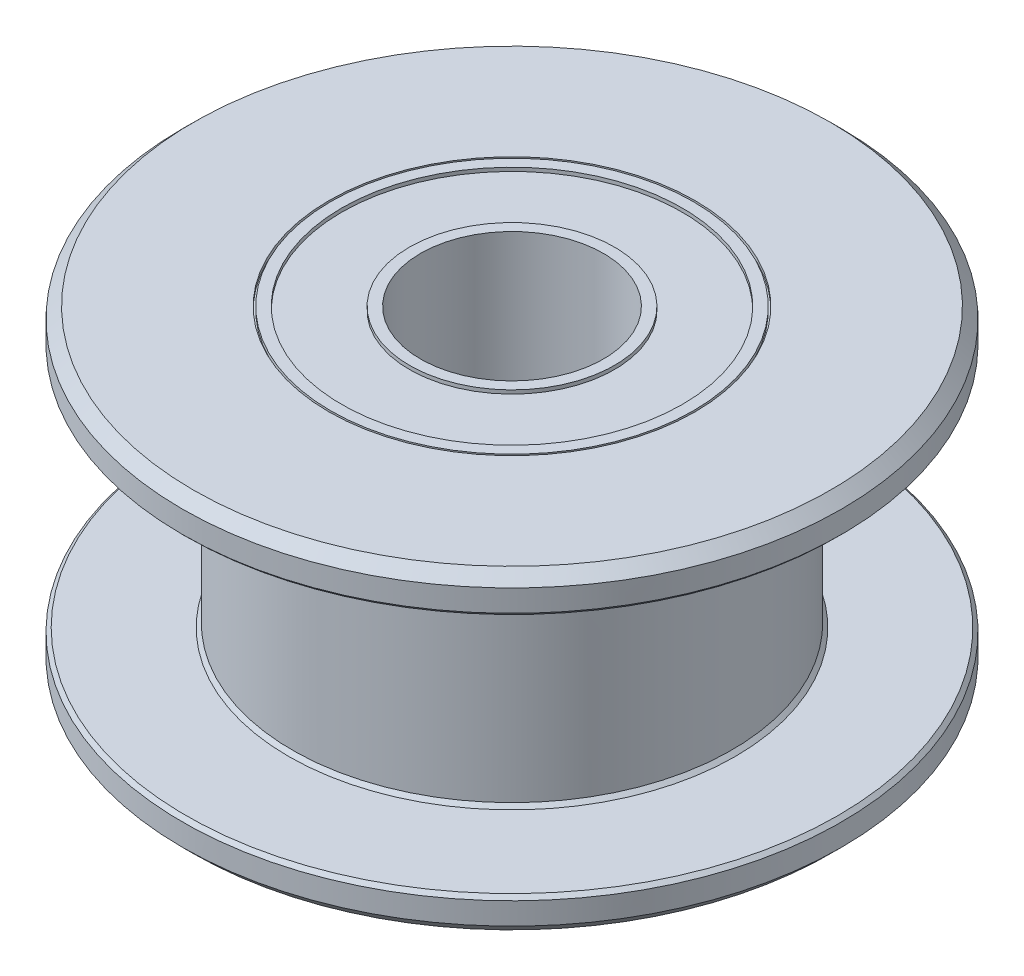
ISO-10303-21;
HEADER;
FILE_DESCRIPTION(('STEP AP214'),'2;1');
FILE_NAME('part.step','',(''),(''),'','','');
FILE_SCHEMA(('AUTOMOTIVE_DESIGN { 1 0 10303 214 1 1 1 1 }'));
ENDSEC;
DATA;
#1=APPLICATION_CONTEXT('core data for automotive mechanical design processes');
#2=APPLICATION_PROTOCOL_DEFINITION('international standard','automotive_design',2000,#1);
#3=PRODUCT_CONTEXT('',#1,'mechanical');
#4=PRODUCT('Part','Part','',(#3));
#5=PRODUCT_RELATED_PRODUCT_CATEGORY('part','',(#4));
#6=PRODUCT_DEFINITION_FORMATION('','',#4);
#7=PRODUCT_DEFINITION_CONTEXT('part definition',#1,'design');
#8=PRODUCT_DEFINITION('design','',#6,#7);
#9=PRODUCT_DEFINITION_SHAPE('','',#8);
#10=(LENGTH_UNIT() NAMED_UNIT(*) SI_UNIT(.MILLI.,.METRE.));
#11=(NAMED_UNIT(*) PLANE_ANGLE_UNIT() SI_UNIT($,.RADIAN.));
#12=(NAMED_UNIT(*) SI_UNIT($,.STERADIAN.) SOLID_ANGLE_UNIT());
#13=UNCERTAINTY_MEASURE_WITH_UNIT(LENGTH_MEASURE(1.E-05),#10,'distance_accuracy_value','');
#14=(GEOMETRIC_REPRESENTATION_CONTEXT(3) GLOBAL_UNCERTAINTY_ASSIGNED_CONTEXT((#13)) GLOBAL_UNIT_ASSIGNED_CONTEXT((#10,
#11,#12)) REPRESENTATION_CONTEXT('',''));
#15=CARTESIAN_POINT('',(0.,0.,0.));
#16=DIRECTION('',(0.,0.,1.));
#17=DIRECTION('',(1.,0.,0.));
#18=AXIS2_PLACEMENT_3D('',#15,#16,#17);
#19=CARTESIAN_POINT('',(-2.5,-20.7507456146053,0.));
#20=DIRECTION('',(0.,1.,0.));
#21=DIRECTION('',(-1.,0.,0.));
#22=AXIS2_PLACEMENT_3D('',#19,#20,#21);
#23=CYLINDRICAL_SURFACE('',#22,2.8);
#24=CARTESIAN_POINT('',(-2.5,-20.7507456146053,0.));
#25=DIRECTION('',(0.,1.,0.));
#26=DIRECTION('',(-1.,0.,0.));
#27=AXIS2_PLACEMENT_3D('',#24,#25,#26);
#28=CIRCLE('',#27,2.8);
#29=CARTESIAN_POINT('',(-5.3,-20.7507456146053,0.));
#30=VERTEX_POINT('',#29);
#31=EDGE_CURVE('E118',#30,#30,#28,.T.);
#32=ORIENTED_EDGE('',*,*,#31,.F.);
#33=EDGE_LOOP('',(#32));
#34=FACE_BOUND('',#33,.T.);
#35=CARTESIAN_POINT('',(-2.5,-20.8507456146053,0.));
#36=DIRECTION('',(0.,1.,0.));
#37=DIRECTION('',(-1.,0.,0.));
#38=AXIS2_PLACEMENT_3D('',#35,#36,#37);
#39=CIRCLE('',#38,2.8);
#40=CARTESIAN_POINT('',(-5.3,-20.8507456146053,0.));
#41=VERTEX_POINT('',#40);
#42=EDGE_CURVE('E85',#41,#41,#39,.T.);
#43=ORIENTED_EDGE('',*,*,#42,.T.);
#44=EDGE_LOOP('',(#43));
#45=FACE_BOUND('',#44,.T.);
#46=ADVANCED_FACE('F43',(#34,#45),#23,.T.);
#47=CARTESIAN_POINT('',(2.15,-20.8507456146053,0.));
#48=DIRECTION('',(0.,-1.,0.));
#49=DIRECTION('',(1.,0.,0.));
#50=AXIS2_PLACEMENT_3D('',#47,#48,#49);
#51=PLANE('',#50);
#52=ORIENTED_EDGE('',*,*,#42,.F.);
#53=EDGE_LOOP('',(#52));
#54=FACE_BOUND('',#53,.T.);
#55=CARTESIAN_POINT('',(-2.5,-20.8507456146053,0.));
#56=DIRECTION('',(0.,1.,0.));
#57=DIRECTION('',(-1.,0.,0.));
#58=AXIS2_PLACEMENT_3D('',#55,#56,#57);
#59=CIRCLE('',#58,4.65);
#60=CARTESIAN_POINT('',(-7.15,-20.8507456146053,0.));
#61=VERTEX_POINT('',#60);
#62=EDGE_CURVE('E84',#61,#61,#59,.T.);
#63=ORIENTED_EDGE('',*,*,#62,.T.);
#64=EDGE_LOOP('',(#63));
#65=FACE_BOUND('',#64,.T.);
#66=ADVANCED_FACE('F127',(#54,#65),#51,.F.);
#67=CARTESIAN_POINT('',(-2.5,-20.7507456146053,0.));
#68=DIRECTION('',(0.,1.,0.));
#69=DIRECTION('',(-1.,0.,0.));
#70=AXIS2_PLACEMENT_3D('',#67,#68,#69);
#71=CYLINDRICAL_SURFACE('',#70,4.65);
#72=ORIENTED_EDGE('',*,*,#62,.F.);
#73=EDGE_LOOP('',(#72));
#74=FACE_BOUND('',#73,.T.);
#75=CARTESIAN_POINT('',(-2.5,-20.7507456146053,0.));
#76=DIRECTION('',(0.,1.,0.));
#77=DIRECTION('',(-1.,0.,0.));
#78=AXIS2_PLACEMENT_3D('',#75,#76,#77);
#79=CIRCLE('',#78,4.65);
#80=CARTESIAN_POINT('',(-7.15,-20.7507456146053,0.));
#81=VERTEX_POINT('',#80);
#82=EDGE_CURVE('E86',#81,#81,#79,.T.);
#83=ORIENTED_EDGE('',*,*,#82,.T.);
#84=EDGE_LOOP('',(#83));
#85=FACE_BOUND('',#84,.T.);
#86=ADVANCED_FACE('F135',(#74,#85),#71,.F.);
#87=CARTESIAN_POINT('',(2.45,-20.7507456146053,0.));
#88=DIRECTION('',(0.,-1.,0.));
#89=DIRECTION('',(1.,0.,0.));
#90=AXIS2_PLACEMENT_3D('',#87,#88,#89);
#91=PLANE('',#90);
#92=ORIENTED_EDGE('',*,*,#82,.F.);
#93=EDGE_LOOP('',(#92));
#94=FACE_BOUND('',#93,.T.);
#95=CARTESIAN_POINT('',(-2.5,-20.7507456146053,0.));
#96=DIRECTION('',(0.,1.,0.));
#97=DIRECTION('',(-1.,0.,0.));
#98=AXIS2_PLACEMENT_3D('',#95,#96,#97);
#99=CIRCLE('',#98,4.95);
#100=CARTESIAN_POINT('',(-7.45,-20.7507456146053,0.));
#101=VERTEX_POINT('',#100);
#102=EDGE_CURVE('E93',#101,#101,#99,.T.);
#103=ORIENTED_EDGE('',*,*,#102,.T.);
#104=EDGE_LOOP('',(#103));
#105=FACE_BOUND('',#104,.T.);
#106=ADVANCED_FACE('F136',(#94,#105),#91,.F.);
#107=CARTESIAN_POINT('',(-2.5,-20.7507456146053,0.));
#108=DIRECTION('',(0.,1.,0.));
#109=DIRECTION('',(-1.,0.,0.));
#110=AXIS2_PLACEMENT_3D('',#107,#108,#109);
#111=CYLINDRICAL_SURFACE('',#110,4.95);
#112=ORIENTED_EDGE('',*,*,#102,.F.);
#113=EDGE_LOOP('',(#112));
#114=FACE_BOUND('',#113,.T.);
#115=CARTESIAN_POINT('',(-2.5,-20.8507456146053,0.));
#116=DIRECTION('',(0.,1.,0.));
#117=DIRECTION('',(-1.,0.,0.));
#118=AXIS2_PLACEMENT_3D('',#115,#116,#117);
#119=CIRCLE('',#118,4.95);
#120=CARTESIAN_POINT('',(-7.45,-20.8507456146053,0.));
#121=VERTEX_POINT('',#120);
#122=EDGE_CURVE('E94',#121,#121,#119,.T.);
#123=ORIENTED_EDGE('',*,*,#122,.T.);
#124=EDGE_LOOP('',(#123));
#125=FACE_BOUND('',#124,.T.);
#126=ADVANCED_FACE('F145',(#114,#125),#111,.T.);
#127=CARTESIAN_POINT('',(2.5,-20.8507456146053,0.));
#128=DIRECTION('',(0.,-1.,0.));
#129=DIRECTION('',(1.,0.,0.));
#130=AXIS2_PLACEMENT_3D('',#127,#128,#129);
#131=PLANE('',#130);
#132=ORIENTED_EDGE('',*,*,#122,.F.);
#133=EDGE_LOOP('',(#132));
#134=FACE_BOUND('',#133,.T.);
#135=CARTESIAN_POINT('',(-2.5,-20.8507456146053,0.));
#136=DIRECTION('',(0.,1.,0.));
#137=DIRECTION('',(-1.,0.,0.));
#138=AXIS2_PLACEMENT_3D('',#135,#136,#137);
#139=CIRCLE('',#138,5.);
#140=CARTESIAN_POINT('',(-7.5,-20.8507456146053,0.));
#141=VERTEX_POINT('',#140);
#142=EDGE_CURVE('E100',#141,#141,#139,.T.);
#143=ORIENTED_EDGE('',*,*,#142,.T.);
#144=EDGE_LOOP('',(#143));
#145=FACE_BOUND('',#144,.T.);
#146=ADVANCED_FACE('F147',(#134,#145),#131,.F.);
#147=CARTESIAN_POINT('',(-2.5,-20.7507456146053,0.));
#148=DIRECTION('',(0.,1.,0.));
#149=DIRECTION('',(-1.,0.,0.));
#150=AXIS2_PLACEMENT_3D('',#147,#148,#149);
#151=CYLINDRICAL_SURFACE('',#150,5.);
#152=ORIENTED_EDGE('',*,*,#142,.F.);
#153=EDGE_LOOP('',(#152));
#154=FACE_BOUND('',#153,.T.);
#155=CARTESIAN_POINT('',(-2.5,-20.7507456146053,0.));
#156=DIRECTION('',(0.,1.,0.));
#157=DIRECTION('',(-1.,0.,0.));
#158=AXIS2_PLACEMENT_3D('',#155,#156,#157);
#159=CIRCLE('',#158,5.);
#160=CARTESIAN_POINT('',(-7.5,-20.7507456146053,0.));
#161=VERTEX_POINT('',#160);
#162=EDGE_CURVE('E99',#161,#161,#159,.T.);
#163=ORIENTED_EDGE('',*,*,#162,.T.);
#164=EDGE_LOOP('',(#163));
#165=FACE_BOUND('',#164,.T.);
#166=ADVANCED_FACE('F156',(#154,#165),#151,.F.);
#167=CARTESIAN_POINT('',(6.5,-20.7507456146053,0.));
#168=DIRECTION('',(0.,-1.,0.));
#169=DIRECTION('',(1.,0.,0.));
#170=AXIS2_PLACEMENT_3D('',#167,#168,#169);
#171=PLANE('',#170);
#172=CARTESIAN_POINT('',(-2.5,-20.7507456146053,0.));
#173=DIRECTION('',(0.,-1.,0.));
#174=DIRECTION('',(1.,0.,0.));
#175=AXIS2_PLACEMENT_3D('',#172,#173,#174);
#176=CIRCLE('',#175,8.69999999999999);
#177=CARTESIAN_POINT('',(-2.5,-20.7507456146053,-8.69999999999999));
#178=VERTEX_POINT('',#177);
#179=EDGE_CURVE('E71',#178,#178,#176,.F.);
#180=ORIENTED_EDGE('',*,*,#179,.T.);
#181=EDGE_LOOP('',(#180));
#182=FACE_BOUND('',#181,.T.);
#183=ORIENTED_EDGE('',*,*,#162,.F.);
#184=EDGE_LOOP('',(#183));
#185=FACE_BOUND('',#184,.T.);
#186=ADVANCED_FACE('F165',(#182,#185),#171,.F.);
#187=CARTESIAN_POINT('',(-2.5,-20.7507456146053,0.));
#188=DIRECTION('',(0.,1.,0.));
#189=DIRECTION('',(-1.,0.,0.));
#190=AXIS2_PLACEMENT_3D('',#187,#188,#189);
#191=CYLINDRICAL_SURFACE('',#190,9.);
#192=CARTESIAN_POINT('',(-2.5,-21.6507456146053,0.));
#193=DIRECTION('',(0.,1.,0.));
#194=DIRECTION('',(0.,0.,1.));
#195=AXIS2_PLACEMENT_3D('',#192,#193,#194);
#196=CIRCLE('',#195,9.);
#197=CARTESIAN_POINT('',(-2.5,-21.6507456146053,9.));
#198=VERTEX_POINT('',#197);
#199=EDGE_CURVE('E51',#198,#198,#196,.T.);
#200=ORIENTED_EDGE('',*,*,#199,.T.);
#201=EDGE_LOOP('',(#200));
#202=FACE_BOUND('',#201,.T.);
#203=CARTESIAN_POINT('',(-2.5,-21.0507456146053,0.));
#204=DIRECTION('',(0.,-1.,0.));
#205=DIRECTION('',(0.,0.,-1.));
#206=AXIS2_PLACEMENT_3D('',#203,#204,#205);
#207=CIRCLE('',#206,9.);
#208=CARTESIAN_POINT('',(-2.5,-21.0507456146053,-9.));
#209=VERTEX_POINT('',#208);
#210=EDGE_CURVE('E69',#209,#209,#207,.T.);
#211=ORIENTED_EDGE('',*,*,#210,.T.);
#212=EDGE_LOOP('',(#211));
#213=FACE_BOUND('',#212,.T.);
#214=ADVANCED_FACE('F170',(#202,#213),#191,.T.);
#215=CARTESIAN_POINT('',(6.5,-21.7507456146053,0.));
#216=DIRECTION('',(0.,1.,0.));
#217=DIRECTION('',(-1.,0.,0.));
#218=AXIS2_PLACEMENT_3D('',#215,#216,#217);
#219=PLANE('',#218);
#220=CARTESIAN_POINT('',(-2.5,-21.7507456146053,0.));
#221=DIRECTION('',(0.,1.,0.));
#222=DIRECTION('',(-1.,0.,0.));
#223=AXIS2_PLACEMENT_3D('',#220,#221,#222);
#224=CIRCLE('',#223,8.89999999999999);
#225=CARTESIAN_POINT('',(-11.4,-21.7507456146053,0.));
#226=VERTEX_POINT('',#225);
#227=EDGE_CURVE('E10',#226,#226,#224,.F.);
#228=ORIENTED_EDGE('',*,*,#227,.T.);
#229=EDGE_LOOP('',(#228));
#230=FACE_BOUND('',#229,.T.);
#231=CARTESIAN_POINT('',(-2.5,-21.7507456146053,0.));
#232=DIRECTION('',(0.,1.,0.));
#233=DIRECTION('',(-1.,0.,0.));
#234=AXIS2_PLACEMENT_3D('',#231,#232,#233);
#235=CIRCLE('',#234,6.);
#236=CARTESIAN_POINT('',(-8.5,-21.7507456146053,0.));
#237=VERTEX_POINT('',#236);
#238=EDGE_CURVE('E103',#237,#237,#235,.T.);
#239=ORIENTED_EDGE('',*,*,#238,.T.);
#240=EDGE_LOOP('',(#239));
#241=FACE_BOUND('',#240,.T.);
#242=ADVANCED_FACE('F171',(#230,#241),#219,.F.);
#243=CARTESIAN_POINT('',(-2.5,-20.7507456146053,0.));
#244=DIRECTION('',(0.,1.,0.));
#245=DIRECTION('',(-1.,0.,0.));
#246=AXIS2_PLACEMENT_3D('',#243,#244,#245);
#247=CYLINDRICAL_SURFACE('',#246,6.);
#248=CARTESIAN_POINT('',(-2.5,-28.2507456146053,0.));
#249=DIRECTION('',(0.,-1.,0.));
#250=DIRECTION('',(0.,0.,-1.));
#251=AXIS2_PLACEMENT_3D('',#248,#249,#250);
#252=CIRCLE('',#251,6.);
#253=CARTESIAN_POINT('',(-2.5,-28.2507456146053,-6.));
#254=VERTEX_POINT('',#253);
#255=EDGE_CURVE('E54',#254,#254,#252,.F.);
#256=ORIENTED_EDGE('',*,*,#255,.T.);
#257=EDGE_LOOP('',(#256));
#258=FACE_BOUND('',#257,.T.);
#259=ORIENTED_EDGE('',*,*,#238,.F.);
#260=EDGE_LOOP('',(#259));
#261=FACE_BOUND('',#260,.T.);
#262=ADVANCED_FACE('F213',(#258,#261),#247,.T.);
#263=CARTESIAN_POINT('',(3.5,-28.3507456146053,0.));
#264=DIRECTION('',(0.,-1.,0.));
#265=DIRECTION('',(1.,0.,0.));
#266=AXIS2_PLACEMENT_3D('',#263,#264,#265);
#267=PLANE('',#266);
#268=CARTESIAN_POINT('',(-2.5,-28.3507456146053,0.));
#269=DIRECTION('',(0.,-1.,0.));
#270=DIRECTION('',(1.,0.,0.));
#271=AXIS2_PLACEMENT_3D('',#268,#269,#270);
#272=CIRCLE('',#271,8.89999999999999);
#273=CARTESIAN_POINT('',(6.39999999999999,-28.3507456146053,0.));
#274=VERTEX_POINT('',#273);
#275=EDGE_CURVE('E64',#274,#274,#272,.F.);
#276=ORIENTED_EDGE('',*,*,#275,.T.);
#277=EDGE_LOOP('',(#276));
#278=FACE_BOUND('',#277,.T.);
#279=CARTESIAN_POINT('',(-2.5,-28.3507456146053,0.));
#280=DIRECTION('',(0.,-1.,0.));
#281=DIRECTION('',(1.,0.,0.));
#282=AXIS2_PLACEMENT_3D('',#279,#280,#281);
#283=CIRCLE('',#282,6.10000000000001);
#284=CARTESIAN_POINT('',(3.60000000000001,-28.3507456146053,0.));
#285=VERTEX_POINT('',#284);
#286=EDGE_CURVE('E70',#285,#285,#283,.T.);
#287=ORIENTED_EDGE('',*,*,#286,.T.);
#288=EDGE_LOOP('',(#287));
#289=FACE_BOUND('',#288,.T.);
#290=ADVANCED_FACE('F216',(#278,#289),#267,.F.);
#291=CARTESIAN_POINT('',(-2.5,-20.7507456146053,0.));
#292=DIRECTION('',(0.,1.,0.));
#293=DIRECTION('',(-1.,0.,0.));
#294=AXIS2_PLACEMENT_3D('',#291,#292,#293);
#295=CYLINDRICAL_SURFACE('',#294,9.);
#296=CARTESIAN_POINT('',(-2.5,-28.4507456146053,0.));
#297=DIRECTION('',(0.,-1.,0.));
#298=DIRECTION('',(0.,0.,-1.));
#299=AXIS2_PLACEMENT_3D('',#296,#297,#298);
#300=CIRCLE('',#299,9.);
#301=CARTESIAN_POINT('',(-2.5,-28.4507456146053,-9.));
#302=VERTEX_POINT('',#301);
#303=EDGE_CURVE('E56',#302,#302,#300,.T.);
#304=ORIENTED_EDGE('',*,*,#303,.T.);
#305=EDGE_LOOP('',(#304));
#306=FACE_BOUND('',#305,.T.);
#307=CARTESIAN_POINT('',(-2.5,-29.0507456146053,0.));
#308=DIRECTION('',(0.,1.,0.));
#309=DIRECTION('',(0.,0.,1.));
#310=AXIS2_PLACEMENT_3D('',#307,#308,#309);
#311=CIRCLE('',#310,9.);
#312=CARTESIAN_POINT('',(-2.5,-29.0507456146053,9.));
#313=VERTEX_POINT('',#312);
#314=EDGE_CURVE('E79',#313,#313,#311,.T.);
#315=ORIENTED_EDGE('',*,*,#314,.T.);
#316=EDGE_LOOP('',(#315));
#317=FACE_BOUND('',#316,.T.);
#318=ADVANCED_FACE('F227',(#306,#317),#295,.T.);
#319=CARTESIAN_POINT('',(6.5,-29.3507456146053,0.));
#320=DIRECTION('',(0.,1.,0.));
#321=DIRECTION('',(-1.,0.,0.));
#322=AXIS2_PLACEMENT_3D('',#319,#320,#321);
#323=PLANE('',#322);
#324=CARTESIAN_POINT('',(-2.5,-29.3507456146053,0.));
#325=DIRECTION('',(0.,1.,0.));
#326=DIRECTION('',(-1.,0.,0.));
#327=AXIS2_PLACEMENT_3D('',#324,#325,#326);
#328=CIRCLE('',#327,8.70000000000001);
#329=CARTESIAN_POINT('',(-11.2,-29.3507456146053,0.));
#330=VERTEX_POINT('',#329);
#331=EDGE_CURVE('E77',#330,#330,#328,.F.);
#332=ORIENTED_EDGE('',*,*,#331,.T.);
#333=EDGE_LOOP('',(#332));
#334=FACE_BOUND('',#333,.T.);
#335=CARTESIAN_POINT('',(-2.5,-29.3507456146053,0.));
#336=DIRECTION('',(0.,1.,0.));
#337=DIRECTION('',(-1.,0.,0.));
#338=AXIS2_PLACEMENT_3D('',#335,#336,#337);
#339=CIRCLE('',#338,4.19021834389778);
#340=CARTESIAN_POINT('',(-6.69021834389778,-29.3507456146053,0.));
#341=VERTEX_POINT('',#340);
#342=EDGE_CURVE('E106',#341,#341,#339,.T.);
#343=ORIENTED_EDGE('',*,*,#342,.T.);
#344=EDGE_LOOP('',(#343));
#345=FACE_BOUND('',#344,.T.);
#346=ADVANCED_FACE('F226',(#334,#345),#323,.F.);
#347=CARTESIAN_POINT('',(-2.5,-20.7507456146053,0.));
#348=DIRECTION('',(0.,1.,0.));
#349=DIRECTION('',(-1.,0.,0.));
#350=AXIS2_PLACEMENT_3D('',#347,#348,#349);
#351=CYLINDRICAL_SURFACE('',#350,4.19021834389778);
#352=ORIENTED_EDGE('',*,*,#342,.F.);
#353=EDGE_LOOP('',(#352));
#354=FACE_BOUND('',#353,.T.);
#355=CARTESIAN_POINT('',(-2.5,-29.2507456146053,0.));
#356=DIRECTION('',(0.,1.,0.));
#357=DIRECTION('',(-1.,0.,0.));
#358=AXIS2_PLACEMENT_3D('',#355,#356,#357);
#359=CIRCLE('',#358,4.19021834389778);
#360=CARTESIAN_POINT('',(-6.69021834389778,-29.2507456146053,0.));
#361=VERTEX_POINT('',#360);
#362=EDGE_CURVE('E108',#361,#361,#359,.T.);
#363=ORIENTED_EDGE('',*,*,#362,.T.);
#364=EDGE_LOOP('',(#363));
#365=FACE_BOUND('',#364,.T.);
#366=ADVANCED_FACE('F231',(#354,#365),#351,.F.);
#367=CARTESIAN_POINT('',(0.,-29.2507456146053,0.));
#368=DIRECTION('',(0.,1.,0.));
#369=DIRECTION('',(-1.,0.,0.));
#370=AXIS2_PLACEMENT_3D('',#367,#368,#369);
#371=PLANE('',#370);
#372=ORIENTED_EDGE('',*,*,#362,.F.);
#373=EDGE_LOOP('',(#372));
#374=FACE_BOUND('',#373,.T.);
#375=CARTESIAN_POINT('',(-2.5,-29.2507456146053,0.));
#376=DIRECTION('',(0.,1.,0.));
#377=DIRECTION('',(-1.,0.,0.));
#378=AXIS2_PLACEMENT_3D('',#375,#376,#377);
#379=CIRCLE('',#378,2.5);
#380=CARTESIAN_POINT('',(-5.,-29.2507456146053,0.));
#381=VERTEX_POINT('',#380);
#382=EDGE_CURVE('E115',#381,#381,#379,.T.);
#383=ORIENTED_EDGE('',*,*,#382,.T.);
#384=EDGE_LOOP('',(#383));
#385=FACE_BOUND('',#384,.T.);
#386=ADVANCED_FACE('F240',(#374,#385),#371,.F.);
#387=CARTESIAN_POINT('',(-2.5,-20.7507456146053,0.));
#388=DIRECTION('',(0.,1.,0.));
#389=DIRECTION('',(-1.,0.,0.));
#390=AXIS2_PLACEMENT_3D('',#387,#388,#389);
#391=CYLINDRICAL_SURFACE('',#390,2.5);
#392=ORIENTED_EDGE('',*,*,#382,.F.);
#393=EDGE_LOOP('',(#392));
#394=FACE_BOUND('',#393,.T.);
#395=CARTESIAN_POINT('',(-2.5,-20.7507456146053,0.));
#396=DIRECTION('',(0.,1.,0.));
#397=DIRECTION('',(-1.,0.,0.));
#398=AXIS2_PLACEMENT_3D('',#395,#396,#397);
#399=CIRCLE('',#398,2.5);
#400=CARTESIAN_POINT('',(-5.,-20.7507456146053,0.));
#401=VERTEX_POINT('',#400);
#402=EDGE_CURVE('E113',#401,#401,#399,.T.);
#403=ORIENTED_EDGE('',*,*,#402,.T.);
#404=EDGE_LOOP('',(#403));
#405=FACE_BOUND('',#404,.T.);
#406=ADVANCED_FACE('F242',(#394,#405),#391,.F.);
#407=CARTESIAN_POINT('',(0.,-20.7507456146053,0.));
#408=DIRECTION('',(0.,-1.,0.));
#409=DIRECTION('',(1.,0.,0.));
#410=AXIS2_PLACEMENT_3D('',#407,#408,#409);
#411=PLANE('',#410);
#412=ORIENTED_EDGE('',*,*,#402,.F.);
#413=EDGE_LOOP('',(#412));
#414=FACE_BOUND('',#413,.T.);
#415=ORIENTED_EDGE('',*,*,#31,.T.);
#416=EDGE_LOOP('',(#415));
#417=FACE_BOUND('',#416,.T.);
#418=ADVANCED_FACE('F125',(#414,#417),#411,.F.);
#419=CARTESIAN_POINT('',(-2.5,-29.0507456146053,0.));
#420=DIRECTION('',(0.,1.,0.));
#421=DIRECTION('',(0.,0.,1.));
#422=AXIS2_PLACEMENT_3D('',#419,#420,#421);
#423=CONICAL_SURFACE('',#422,9.,0.785398163397434);
#424=ORIENTED_EDGE('',*,*,#331,.F.);
#425=EDGE_LOOP('',(#424));
#426=FACE_BOUND('',#425,.T.);
#427=ORIENTED_EDGE('',*,*,#314,.F.);
#428=EDGE_LOOP('',(#427));
#429=FACE_BOUND('',#428,.T.);
#430=ADVANCED_FACE('F179',(#426,#429),#423,.T.);
#431=CARTESIAN_POINT('',(-2.5,-20.7507456146053,0.));
#432=DIRECTION('',(0.,-1.,0.));
#433=DIRECTION('',(0.,0.,-1.));
#434=AXIS2_PLACEMENT_3D('',#431,#432,#433);
#435=CONICAL_SURFACE('',#434,8.69999999999999,0.785398163397451);
#436=CARTESIAN_POINT('',(-2.5,-21.0507456146053,-9.));
#437=CARTESIAN_POINT('',(-2.5,-21.0476206146053,-8.996875));
#438=CARTESIAN_POINT('',(-2.5,-21.0444956146053,-8.99375));
#439=CARTESIAN_POINT('',(-2.5,-21.0382456146053,-8.9875));
#440=CARTESIAN_POINT('',(-2.5,-21.0351206146053,-8.984375));
#441=CARTESIAN_POINT('',(-2.5,-21.0288706146053,-8.978125));
#442=CARTESIAN_POINT('',(-2.5,-21.0257456146053,-8.97499999999999));
#443=CARTESIAN_POINT('',(-2.5,-21.0194956146053,-8.96875));
#444=CARTESIAN_POINT('',(-2.5,-21.0163706146053,-8.96562499999999));
#445=CARTESIAN_POINT('',(-2.5,-21.0101206146053,-8.95937499999999));
#446=CARTESIAN_POINT('',(-2.5,-21.0069956146053,-8.95624999999999));
#447=CARTESIAN_POINT('',(-2.5,-21.0007456146053,-8.94999999999999));
#448=CARTESIAN_POINT('',(-2.5,-20.9976206146053,-8.946875));
#449=CARTESIAN_POINT('',(-2.5,-20.9913706146053,-8.940625));
#450=CARTESIAN_POINT('',(-2.5,-20.9882456146053,-8.9375));
#451=CARTESIAN_POINT('',(-2.5,-20.9819956146053,-8.93124999999999));
#452=CARTESIAN_POINT('',(-2.5,-20.9788706146053,-8.92812499999999));
#453=CARTESIAN_POINT('',(-2.5,-20.9726206146053,-8.92187499999999));
#454=CARTESIAN_POINT('',(-2.5,-20.9694956146053,-8.91874999999999));
#455=CARTESIAN_POINT('',(-2.5,-20.9632456146053,-8.91249999999999));
#456=CARTESIAN_POINT('',(-2.5,-20.9601206146053,-8.90937499999999));
#457=CARTESIAN_POINT('',(-2.5,-20.9538706146053,-8.90312499999999));
#458=CARTESIAN_POINT('',(-2.5,-20.9507456146053,-8.89999999999999));
#459=CARTESIAN_POINT('',(-2.5,-20.9444956146053,-8.89374999999999));
#460=CARTESIAN_POINT('',(-2.5,-20.9413706146053,-8.89062499999999));
#461=CARTESIAN_POINT('',(-2.5,-20.9351206146053,-8.88437499999999));
#462=CARTESIAN_POINT('',(-2.5,-20.9319956146053,-8.88124999999999));
#463=CARTESIAN_POINT('',(-2.5,-20.9257456146053,-8.87499999999999));
#464=CARTESIAN_POINT('',(-2.5,-20.9226206146053,-8.87187499999999));
#465=CARTESIAN_POINT('',(-2.5,-20.9163706146053,-8.86562499999999));
#466=CARTESIAN_POINT('',(-2.5,-20.9132456146053,-8.86249999999999));
#467=CARTESIAN_POINT('',(-2.5,-20.9069956146053,-8.85624999999999));
#468=CARTESIAN_POINT('',(-2.5,-20.9038706146053,-8.85312499999999));
#469=CARTESIAN_POINT('',(-2.5,-20.8976206146053,-8.84687499999999));
#470=CARTESIAN_POINT('',(-2.5,-20.8944956146053,-8.84374999999999));
#471=CARTESIAN_POINT('',(-2.5,-20.8882456146053,-8.83749999999999));
#472=CARTESIAN_POINT('',(-2.5,-20.8851206146053,-8.83437499999999));
#473=CARTESIAN_POINT('',(-2.5,-20.8788706146053,-8.82812499999999));
#474=CARTESIAN_POINT('',(-2.5,-20.8757456146053,-8.82499999999999));
#475=CARTESIAN_POINT('',(-2.5,-20.8694956146053,-8.81874999999999));
#476=CARTESIAN_POINT('',(-2.5,-20.8663706146053,-8.81562499999999));
#477=CARTESIAN_POINT('',(-2.5,-20.8601206146053,-8.80937499999999));
#478=CARTESIAN_POINT('',(-2.5,-20.8569956146053,-8.80624999999999));
#479=CARTESIAN_POINT('',(-2.5,-20.8507456146053,-8.79999999999999));
#480=CARTESIAN_POINT('',(-2.5,-20.8476206146053,-8.79687499999999));
#481=CARTESIAN_POINT('',(-2.5,-20.8413706146053,-8.79062499999999));
#482=CARTESIAN_POINT('',(-2.5,-20.8382456146053,-8.78749999999999));
#483=CARTESIAN_POINT('',(-2.5,-20.8319956146053,-8.78124999999999));
#484=CARTESIAN_POINT('',(-2.5,-20.8288706146053,-8.77812499999999));
#485=CARTESIAN_POINT('',(-2.5,-20.8226206146053,-8.77187499999999));
#486=CARTESIAN_POINT('',(-2.5,-20.8194956146053,-8.76874999999999));
#487=CARTESIAN_POINT('',(-2.5,-20.8132456146053,-8.76249999999999));
#488=CARTESIAN_POINT('',(-2.5,-20.8101206146053,-8.75937499999999));
#489=CARTESIAN_POINT('',(-2.5,-20.8038706146053,-8.75312499999999));
#490=CARTESIAN_POINT('',(-2.5,-20.8007456146053,-8.74999999999999));
#491=CARTESIAN_POINT('',(-2.5,-20.7944956146053,-8.74374999999999));
#492=CARTESIAN_POINT('',(-2.5,-20.7913706146053,-8.74062499999999));
#493=CARTESIAN_POINT('',(-2.5,-20.7851206146053,-8.73437499999999));
#494=CARTESIAN_POINT('',(-2.5,-20.7819956146053,-8.73124999999999));
#495=CARTESIAN_POINT('',(-2.5,-20.7757456146053,-8.72499999999999));
#496=CARTESIAN_POINT('',(-2.5,-20.7726206146053,-8.72187499999999));
#497=CARTESIAN_POINT('',(-2.5,-20.7663706146053,-8.71562499999999));
#498=CARTESIAN_POINT('',(-2.5,-20.7632456146053,-8.71249999999999));
#499=CARTESIAN_POINT('',(-2.5,-20.7569956146053,-8.70624999999999));
#500=CARTESIAN_POINT('',(-2.5,-20.7538706146053,-8.70312499999999));
#501=CARTESIAN_POINT('',(-2.5,-20.7507456146053,-8.69999999999999));
#502=B_SPLINE_CURVE_WITH_KNOTS('',3,(#436,#437,#438,#439,#440,#441,#442,#443,#444,#445,#446,
#447,#448,#449,#450,#451,#452,#453,#454,#455,#456,#457,#458,#459,#460,#461,#462,#463,#464,#465,
#466,#467,#468,#469,#470,#471,#472,#473,#474,#475,#476,#477,#478,#479,#480,#481,#482,#483,#484,
#485,#486,#487,#488,#489,#490,#491,#492,#493,#494,#495,#496,#497,#498,#499,#500,#501),
.UNSPECIFIED.,.F.,.F.,(4,2,2,2,2,2,2,2,2,2,2,2,2,2,2,2,2,2,2,2,2,2,2,2,2,2,2,2,2,2,2,2,4),(0.,
0.01325825214725,0.0265165042944963,0.0397747564417463,0.0530330085889938,0.0662912607362414,
0.0795495128834901,0.0928077650307376,0.106066017177985,0.119324269325234,0.132582521472481,
0.145840773619729,0.159099025766979,0.172357277914225,0.185615530061473,0.198873782208723,
0.212132034355969,0.225390286503217,0.238648538650467,0.251906790797714,0.26516504294496,
0.27842329509221,0.291681547239458,0.304939799386706,0.318198051533954,0.331456303681202,
0.344714555828449,0.357972807975698,0.371231060122946,0.384489312270193,0.397747564417443,
0.411005816564689,0.424264068711937),.UNSPECIFIED.);
#503=EDGE_CURVE('BSEAM187',#209,#178,#502,.T.);
#504=ORIENTED_EDGE('',*,*,#210,.F.);
#505=ORIENTED_EDGE('',*,*,#179,.F.);
#506=ORIENTED_EDGE('',*,*,#503,.T.);
#507=ORIENTED_EDGE('',*,*,#503,.F.);
#508=EDGE_LOOP('',(#504,#506,#505,#507));
#509=FACE_BOUND('',#508,.T.);
#510=ADVANCED_FACE('F187',(#509),#435,.T.);
#511=CARTESIAN_POINT('',(-2.5,-28.3507456146053,0.));
#512=DIRECTION('',(0.,-1.,0.));
#513=DIRECTION('',(0.,0.,-1.));
#514=AXIS2_PLACEMENT_3D('',#511,#512,#513);
#515=CONICAL_SURFACE('',#514,8.89999999999999,0.785398163397457);
#516=ORIENTED_EDGE('',*,*,#303,.F.);
#517=EDGE_LOOP('',(#516));
#518=FACE_BOUND('',#517,.T.);
#519=ORIENTED_EDGE('',*,*,#275,.F.);
#520=EDGE_LOOP('',(#519));
#521=FACE_BOUND('',#520,.T.);
#522=ADVANCED_FACE('F191',(#518,#521),#515,.T.);
#523=CARTESIAN_POINT('',(-2.5,-28.2507456146053,0.));
#524=DIRECTION('',(0.,-1.,0.));
#525=DIRECTION('',(0.,0.,-1.));
#526=AXIS2_PLACEMENT_3D('',#523,#524,#525);
#527=CONICAL_SURFACE('',#526,6.,0.785398163397435);
#528=ORIENTED_EDGE('',*,*,#286,.F.);
#529=EDGE_LOOP('',(#528));
#530=FACE_BOUND('',#529,.T.);
#531=ORIENTED_EDGE('',*,*,#255,.F.);
#532=EDGE_LOOP('',(#531));
#533=FACE_BOUND('',#532,.T.);
#534=ADVANCED_FACE('F200',(#530,#533),#527,.T.);
#535=CARTESIAN_POINT('',(-2.5,-21.6507456146053,0.));
#536=DIRECTION('',(0.,1.,0.));
#537=DIRECTION('',(0.,0.,1.));
#538=AXIS2_PLACEMENT_3D('',#535,#536,#537);
#539=CONICAL_SURFACE('',#538,9.,0.785398163397448);
#540=ORIENTED_EDGE('',*,*,#227,.F.);
#541=EDGE_LOOP('',(#540));
#542=FACE_BOUND('',#541,.T.);
#543=ORIENTED_EDGE('',*,*,#199,.F.);
#544=EDGE_LOOP('',(#543));
#545=FACE_BOUND('',#544,.T.);
#546=ADVANCED_FACE('F46',(#542,#545),#539,.T.);
#547=CLOSED_SHELL('',(#46,#66,#86,#106,#126,#146,#166,#186,#214,#242,#262,#290,#318,#346,#366,
#386,#406,#418,#430,#510,#522,#534,#546));
#548=MANIFOLD_SOLID_BREP('B2',#547);
#549=ADVANCED_BREP_SHAPE_REPRESENTATION('',(#18,#548),#14);
#550=SHAPE_DEFINITION_REPRESENTATION(#9,#549);
ENDSEC;
END-ISO-10303-21;
